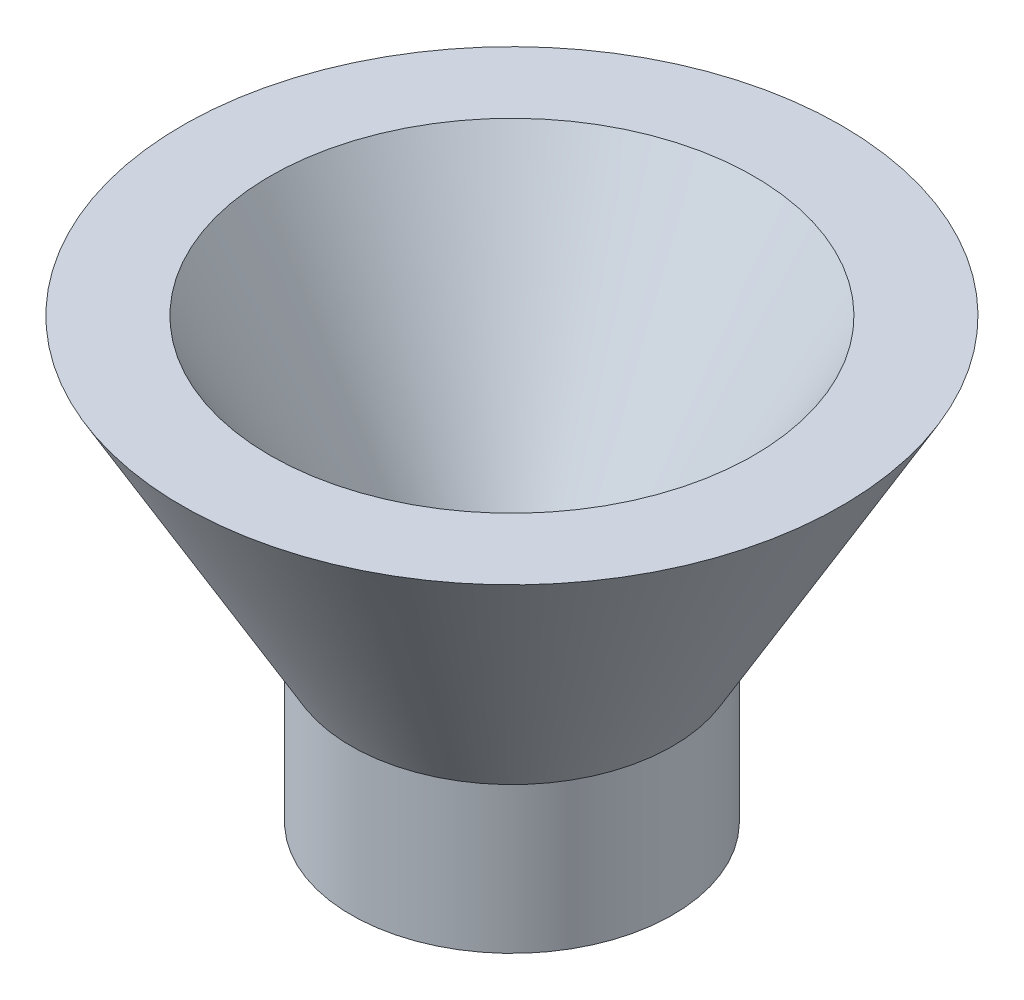
ISO-10303-21;
HEADER;
FILE_DESCRIPTION(('STEP AP214'),'2;1');
FILE_NAME('part.step','',(''),(''),'','','');
FILE_SCHEMA(('AUTOMOTIVE_DESIGN { 1 0 10303 214 1 1 1 1 }'));
ENDSEC;
DATA;
#1=APPLICATION_CONTEXT('core data for automotive mechanical design processes');
#2=APPLICATION_PROTOCOL_DEFINITION('international standard','automotive_design',2000,#1);
#3=PRODUCT_CONTEXT('',#1,'mechanical');
#4=PRODUCT('Part','Part','',(#3));
#5=PRODUCT_RELATED_PRODUCT_CATEGORY('part','',(#4));
#6=PRODUCT_DEFINITION_FORMATION('','',#4);
#7=PRODUCT_DEFINITION_CONTEXT('part definition',#1,'design');
#8=PRODUCT_DEFINITION('design','',#6,#7);
#9=PRODUCT_DEFINITION_SHAPE('','',#8);
#10=(LENGTH_UNIT() NAMED_UNIT(*) SI_UNIT(.MILLI.,.METRE.));
#11=(NAMED_UNIT(*) PLANE_ANGLE_UNIT() SI_UNIT($,.RADIAN.));
#12=(NAMED_UNIT(*) SI_UNIT($,.STERADIAN.) SOLID_ANGLE_UNIT());
#13=UNCERTAINTY_MEASURE_WITH_UNIT(LENGTH_MEASURE(1.E-05),#10,'distance_accuracy_value','');
#14=(GEOMETRIC_REPRESENTATION_CONTEXT(3) GLOBAL_UNCERTAINTY_ASSIGNED_CONTEXT((#13)) GLOBAL_UNIT_ASSIGNED_CONTEXT((#10,
#11,#12)) REPRESENTATION_CONTEXT('',''));
#15=CARTESIAN_POINT('',(0.,0.,0.));
#16=DIRECTION('',(0.,0.,1.));
#17=DIRECTION('',(1.,0.,0.));
#18=AXIS2_PLACEMENT_3D('',#15,#16,#17);
#19=CARTESIAN_POINT('',(5.5,0.,0.));
#20=DIRECTION('',(0.,-1.,0.));
#21=DIRECTION('',(0.,0.,-1.));
#22=AXIS2_PLACEMENT_3D('',#19,#20,#21);
#23=PLANE('',#22);
#24=CARTESIAN_POINT('',(0.,0.,0.));
#25=DIRECTION('',(0.,-1.,0.));
#26=DIRECTION('',(0.,0.,-1.));
#27=AXIS2_PLACEMENT_3D('',#24,#25,#26);
#28=CIRCLE('',#27,5.5);
#29=CARTESIAN_POINT('',(0.,0.,-5.5));
#30=VERTEX_POINT('',#29);
#31=EDGE_CURVE('E53',#30,#30,#28,.T.);
#32=ORIENTED_EDGE('',*,*,#31,.T.);
#33=EDGE_LOOP('',(#32));
#34=FACE_BOUND('',#33,.T.);
#35=CARTESIAN_POINT('',(0.,0.,0.));
#36=DIRECTION('',(0.,-1.,0.));
#37=DIRECTION('',(0.,0.,-1.));
#38=AXIS2_PLACEMENT_3D('',#35,#36,#37);
#39=CIRCLE('',#38,2.5);
#40=CARTESIAN_POINT('',(0.,0.,-2.5));
#41=VERTEX_POINT('',#40);
#42=EDGE_CURVE('E10',#41,#41,#39,.T.);
#43=ORIENTED_EDGE('',*,*,#42,.F.);
#44=EDGE_LOOP('',(#43));
#45=FACE_BOUND('',#44,.T.);
#46=ADVANCED_FACE('F31',(#34,#45),#23,.T.);
#47=CARTESIAN_POINT('',(0.,0.,0.));
#48=DIRECTION('',(0.,-1.,0.));
#49=DIRECTION('',(0.,0.,-1.));
#50=AXIS2_PLACEMENT_3D('',#47,#48,#49);
#51=CYLINDRICAL_SURFACE('',#50,2.5);
#52=ORIENTED_EDGE('',*,*,#42,.T.);
#53=EDGE_LOOP('',(#52));
#54=FACE_BOUND('',#53,.T.);
#55=CARTESIAN_POINT('',(0.,5.,0.));
#56=DIRECTION('',(0.,-1.,0.));
#57=DIRECTION('',(0.,0.,-1.));
#58=AXIS2_PLACEMENT_3D('',#55,#56,#57);
#59=CIRCLE('',#58,2.5);
#60=CARTESIAN_POINT('',(0.,5.,2.5));
#61=VERTEX_POINT('',#60);
#62=EDGE_CURVE('E37',#61,#61,#59,.T.);
#63=ORIENTED_EDGE('',*,*,#62,.F.);
#64=EDGE_LOOP('',(#63));
#65=FACE_BOUND('',#64,.T.);
#66=ADVANCED_FACE('F71',(#54,#65),#51,.F.);
#67=CARTESIAN_POINT('',(0.,15.,0.));
#68=DIRECTION('',(0.,1.,0.));
#69=DIRECTION('',(0.,0.,1.));
#70=AXIS2_PLACEMENT_3D('',#67,#68,#69);
#71=CONICAL_SURFACE('',#70,8.27350269189627,0.5235987755983);
#72=CARTESIAN_POINT('',(0.,15.,0.));
#73=DIRECTION('',(0.,-1.,0.));
#74=DIRECTION('',(0.,0.,-1.));
#75=AXIS2_PLACEMENT_3D('',#72,#73,#74);
#76=CIRCLE('',#75,8.27350269189627);
#77=CARTESIAN_POINT('',(0.,15.,8.27350269189627));
#78=VERTEX_POINT('',#77);
#79=EDGE_CURVE('E41',#78,#78,#76,.T.);
#80=CARTESIAN_POINT('',(0.,5.,2.5));
#81=CARTESIAN_POINT('',(0.,5.10416666666667,2.56014065304059));
#82=CARTESIAN_POINT('',(0.,5.20833333333333,2.62028130608117));
#83=CARTESIAN_POINT('',(0.,5.41666666666667,2.74056261216235));
#84=CARTESIAN_POINT('',(0.,5.52083333333333,2.80070326520293));
#85=CARTESIAN_POINT('',(0.,5.72916666666667,2.9209845712841));
#86=CARTESIAN_POINT('',(0.,5.83333333333334,2.98112522432469));
#87=CARTESIAN_POINT('',(0.,6.04166666666667,3.10140653040586));
#88=CARTESIAN_POINT('',(0.,6.14583333333333,3.16154718344645));
#89=CARTESIAN_POINT('',(0.,6.35416666666667,3.28182848952762));
#90=CARTESIAN_POINT('',(0.,6.45833333333333,3.34196914256821));
#91=CARTESIAN_POINT('',(0.,6.66666666666667,3.46225044864938));
#92=CARTESIAN_POINT('',(0.,6.77083333333333,3.52239110168997));
#93=CARTESIAN_POINT('',(0.,6.97916666666667,3.64267240777114));
#94=CARTESIAN_POINT('',(0.,7.08333333333333,3.70281306081172));
#95=CARTESIAN_POINT('',(0.,7.29166666666667,3.8230943668929));
#96=CARTESIAN_POINT('',(0.,7.39583333333333,3.88323501993348));
#97=CARTESIAN_POINT('',(0.,7.60416666666667,4.00351632601465));
#98=CARTESIAN_POINT('',(0.,7.70833333333333,4.06365697905524));
#99=CARTESIAN_POINT('',(0.,7.91666666666667,4.18393828513641));
#100=CARTESIAN_POINT('',(0.,8.02083333333333,4.244078938177));
#101=CARTESIAN_POINT('',(0.,8.22916666666667,4.36436024425817));
#102=CARTESIAN_POINT('',(0.,8.33333333333333,4.42450089729876));
#103=CARTESIAN_POINT('',(0.,8.54166666666667,4.54478220337993));
#104=CARTESIAN_POINT('',(0.,8.64583333333333,4.60492285642052));
#105=CARTESIAN_POINT('',(0.,8.85416666666667,4.72520416250169));
#106=CARTESIAN_POINT('',(0.,8.95833333333333,4.78534481554227));
#107=CARTESIAN_POINT('',(0.,9.16666666666667,4.90562612162345));
#108=CARTESIAN_POINT('',(0.,9.27083333333333,4.96576677466403));
#109=CARTESIAN_POINT('',(0.,9.47916666666667,5.08604808074521));
#110=CARTESIAN_POINT('',(0.,9.58333333333333,5.14618873378579));
#111=CARTESIAN_POINT('',(0.,9.79166666666667,5.26647003986696));
#112=CARTESIAN_POINT('',(0.,9.89583333333333,5.32661069290755));
#113=CARTESIAN_POINT('',(0.,10.1041666666667,5.44689199898872));
#114=CARTESIAN_POINT('',(0.,10.2083333333333,5.50703265202931));
#115=CARTESIAN_POINT('',(0.,10.4166666666667,5.62731395811048));
#116=CARTESIAN_POINT('',(0.,10.5208333333333,5.68745461115107));
#117=CARTESIAN_POINT('',(0.,10.7291666666667,5.80773591723224));
#118=CARTESIAN_POINT('',(0.,10.8333333333333,5.86787657027283));
#119=CARTESIAN_POINT('',(0.,11.0416666666667,5.988157876354));
#120=CARTESIAN_POINT('',(0.,11.1458333333333,6.04829852939458));
#121=CARTESIAN_POINT('',(0.,11.3541666666667,6.16857983547576));
#122=CARTESIAN_POINT('',(0.,11.4583333333333,6.22872048851634));
#123=CARTESIAN_POINT('',(0.,11.6666666666667,6.34900179459752));
#124=CARTESIAN_POINT('',(0.,11.7708333333333,6.4091424476381));
#125=CARTESIAN_POINT('',(0.,11.9791666666667,6.52942375371927));
#126=CARTESIAN_POINT('',(0.,12.0833333333333,6.58956440675986));
#127=CARTESIAN_POINT('',(0.,12.2916666666667,6.70984571284103));
#128=CARTESIAN_POINT('',(0.,12.3958333333333,6.76998636588162));
#129=CARTESIAN_POINT('',(0.,12.6041666666667,6.89026767196279));
#130=CARTESIAN_POINT('',(0.,12.7083333333333,6.95040832500338));
#131=CARTESIAN_POINT('',(0.,12.9166666666667,7.07068963108455));
#132=CARTESIAN_POINT('',(0.,13.0208333333333,7.13083028412514));
#133=CARTESIAN_POINT('',(0.,13.2291666666667,7.25111159020631));
#134=CARTESIAN_POINT('',(0.,13.3333333333333,7.31125224324689));
#135=CARTESIAN_POINT('',(0.,13.5416666666667,7.43153354932807));
#136=CARTESIAN_POINT('',(0.,13.6458333333333,7.49167420236865));
#137=CARTESIAN_POINT('',(0.,13.8541666666667,7.61195550844982));
#138=CARTESIAN_POINT('',(0.,13.9583333333333,7.67209616149041));
#139=CARTESIAN_POINT('',(0.,14.1666666666667,7.79237746757158));
#140=CARTESIAN_POINT('',(0.,14.2708333333333,7.85251812061217));
#141=CARTESIAN_POINT('',(0.,14.4791666666667,7.97279942669334));
#142=CARTESIAN_POINT('',(0.,14.5833333333333,8.03294007973393));
#143=CARTESIAN_POINT('',(0.,14.7916666666667,8.1532213858151));
#144=CARTESIAN_POINT('',(0.,14.8958333333333,8.21336203885569));
#145=CARTESIAN_POINT('',(0.,15.,8.27350269189627));
#146=B_SPLINE_CURVE_WITH_KNOTS('',3,(#80,#81,#82,#83,#84,#85,#86,#87,#88,#89,#90,#91,#92,#93,
#94,#95,#96,#97,#98,#99,#100,#101,#102,#103,#104,#105,#106,#107,#108,#109,#110,#111,#112,#113,
#114,#115,#116,#117,#118,#119,#120,#121,#122,#123,#124,#125,#126,#127,#128,#129,#130,#131,#132,
#133,#134,#135,#136,#137,#138,#139,#140,#141,#142,#143,#144,#145),.UNSPECIFIED.,.F.,.F.,(4,2,2,
2,2,2,2,2,2,2,2,2,2,2,2,2,2,2,2,2,2,2,2,2,2,2,2,2,2,2,2,2,4),(0.,0.360843918243517,
0.721687836487033,1.08253175473055,1.44337567297406,1.80421959121758,2.1650635094611,
2.52590742770461,2.88675134594813,3.24759526419165,3.60843918243516,3.96928310067868,
4.3301270189222,4.69097093716571,5.05181485540923,5.41265877365274,5.77350269189626,
6.13434661013978,6.49519052838329,6.85603444662681,7.21687836487033,7.57772228311384,
7.93856620135736,8.29941011960088,8.66025403784439,9.02109795608791,9.38194187433143,
9.74278579257494,10.1036297108185,10.464473629062,10.8253175473055,11.186161465549,
11.5470053837925),.UNSPECIFIED.);
#147=EDGE_CURVE('BSEAM75',#61,#78,#146,.T.);
#148=ORIENTED_EDGE('',*,*,#62,.T.);
#149=ORIENTED_EDGE('',*,*,#79,.F.);
#150=ORIENTED_EDGE('',*,*,#147,.T.);
#151=ORIENTED_EDGE('',*,*,#147,.F.);
#152=EDGE_LOOP('',(#148,#150,#149,#151));
#153=FACE_BOUND('',#152,.T.);
#154=ADVANCED_FACE('F75',(#153),#71,.F.);
#155=CARTESIAN_POINT('',(8.27350269189627,15.,0.));
#156=DIRECTION('',(0.,1.,0.));
#157=DIRECTION('',(0.,0.,1.));
#158=AXIS2_PLACEMENT_3D('',#155,#156,#157);
#159=PLANE('',#158);
#160=ORIENTED_EDGE('',*,*,#79,.T.);
#161=EDGE_LOOP('',(#160));
#162=FACE_BOUND('',#161,.T.);
#163=CARTESIAN_POINT('',(0.,15.,0.));
#164=DIRECTION('',(0.,-1.,0.));
#165=DIRECTION('',(0.,0.,-1.));
#166=AXIS2_PLACEMENT_3D('',#163,#164,#165);
#167=CIRCLE('',#166,11.2735026918963);
#168=CARTESIAN_POINT('',(0.,15.,-11.2735026918963));
#169=VERTEX_POINT('',#168);
#170=EDGE_CURVE('E45',#169,#169,#167,.T.);
#171=ORIENTED_EDGE('',*,*,#170,.F.);
#172=EDGE_LOOP('',(#171));
#173=FACE_BOUND('',#172,.T.);
#174=ADVANCED_FACE('F67',(#162,#173),#159,.T.);
#175=CARTESIAN_POINT('',(0.,5.,0.));
#176=DIRECTION('',(0.,1.,0.));
#177=DIRECTION('',(0.,0.,1.));
#178=AXIS2_PLACEMENT_3D('',#175,#176,#177);
#179=CONICAL_SURFACE('',#178,5.5,0.5235987755983);
#180=ORIENTED_EDGE('',*,*,#170,.T.);
#181=EDGE_LOOP('',(#180));
#182=FACE_BOUND('',#181,.T.);
#183=CARTESIAN_POINT('',(0.,5.,0.));
#184=DIRECTION('',(0.,-1.,0.));
#185=DIRECTION('',(0.,0.,-1.));
#186=AXIS2_PLACEMENT_3D('',#183,#184,#185);
#187=CIRCLE('',#186,5.5);
#188=CARTESIAN_POINT('',(0.,5.,-5.5));
#189=VERTEX_POINT('',#188);
#190=EDGE_CURVE('E50',#189,#189,#187,.T.);
#191=ORIENTED_EDGE('',*,*,#190,.F.);
#192=EDGE_LOOP('',(#191));
#193=FACE_BOUND('',#192,.T.);
#194=ADVANCED_FACE('F61',(#182,#193),#179,.T.);
#195=CARTESIAN_POINT('',(0.,0.,0.));
#196=DIRECTION('',(0.,-1.,0.));
#197=DIRECTION('',(0.,0.,-1.));
#198=AXIS2_PLACEMENT_3D('',#195,#196,#197);
#199=CYLINDRICAL_SURFACE('',#198,5.5);
#200=ORIENTED_EDGE('',*,*,#190,.T.);
#201=EDGE_LOOP('',(#200));
#202=FACE_BOUND('',#201,.T.);
#203=ORIENTED_EDGE('',*,*,#31,.F.);
#204=EDGE_LOOP('',(#203));
#205=FACE_BOUND('',#204,.T.);
#206=ADVANCED_FACE('F59',(#202,#205),#199,.T.);
#207=CLOSED_SHELL('',(#46,#66,#154,#174,#194,#206));
#208=MANIFOLD_SOLID_BREP('B2',#207);
#209=ADVANCED_BREP_SHAPE_REPRESENTATION('',(#18,#208),#14);
#210=SHAPE_DEFINITION_REPRESENTATION(#9,#209);
ENDSEC;
END-ISO-10303-21;
